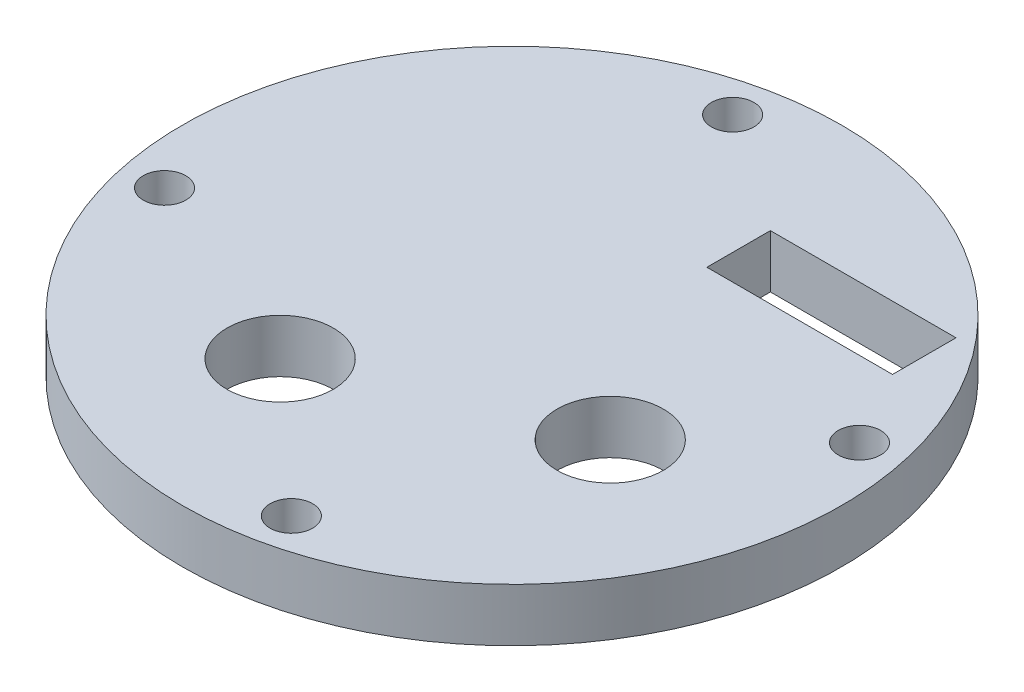
ISO-10303-21;
HEADER;
FILE_DESCRIPTION(('STEP AP214'),'2;1');
FILE_NAME('part.step','',(''),(''),'','','');
FILE_SCHEMA(('AUTOMOTIVE_DESIGN { 1 0 10303 214 1 1 1 1 }'));
ENDSEC;
DATA;
#1=APPLICATION_CONTEXT('core data for automotive mechanical design processes');
#2=APPLICATION_PROTOCOL_DEFINITION('international standard','automotive_design',2000,#1);
#3=PRODUCT_CONTEXT('',#1,'mechanical');
#4=PRODUCT('Part','Part','',(#3));
#5=PRODUCT_RELATED_PRODUCT_CATEGORY('part','',(#4));
#6=PRODUCT_DEFINITION_FORMATION('','',#4);
#7=PRODUCT_DEFINITION_CONTEXT('part definition',#1,'design');
#8=PRODUCT_DEFINITION('design','',#6,#7);
#9=PRODUCT_DEFINITION_SHAPE('','',#8);
#10=(LENGTH_UNIT() NAMED_UNIT(*) SI_UNIT(.MILLI.,.METRE.));
#11=(NAMED_UNIT(*) PLANE_ANGLE_UNIT() SI_UNIT($,.RADIAN.));
#12=(NAMED_UNIT(*) SI_UNIT($,.STERADIAN.) SOLID_ANGLE_UNIT());
#13=UNCERTAINTY_MEASURE_WITH_UNIT(LENGTH_MEASURE(1.E-05),#10,'distance_accuracy_value','');
#14=(GEOMETRIC_REPRESENTATION_CONTEXT(3) GLOBAL_UNCERTAINTY_ASSIGNED_CONTEXT((#13)) GLOBAL_UNIT_ASSIGNED_CONTEXT((#10,
#11,#12)) REPRESENTATION_CONTEXT('',''));
#15=CARTESIAN_POINT('',(0.,0.,0.));
#16=DIRECTION('',(0.,0.,1.));
#17=DIRECTION('',(1.,0.,0.));
#18=AXIS2_PLACEMENT_3D('',#15,#16,#17);
#19=CARTESIAN_POINT('',(0.,5.,0.));
#20=DIRECTION('',(0.,-1.,0.));
#21=DIRECTION('',(0.,0.,-1.));
#22=AXIS2_PLACEMENT_3D('',#19,#20,#21);
#23=CYLINDRICAL_SURFACE('',#22,31.);
#24=CARTESIAN_POINT('',(0.,5.,0.));
#25=DIRECTION('',(0.,1.,0.));
#26=DIRECTION('',(0.,0.,1.));
#27=AXIS2_PLACEMENT_3D('',#24,#25,#26);
#28=CIRCLE('',#27,31.);
#29=CARTESIAN_POINT('',(0.,5.,31.));
#30=VERTEX_POINT('',#29);
#31=EDGE_CURVE('E11',#30,#30,#28,.T.);
#32=ORIENTED_EDGE('',*,*,#31,.F.);
#33=EDGE_LOOP('',(#32));
#34=FACE_BOUND('',#33,.T.);
#35=CARTESIAN_POINT('',(0.,0.,0.));
#36=DIRECTION('',(0.,1.,0.));
#37=DIRECTION('',(0.,0.,1.));
#38=AXIS2_PLACEMENT_3D('',#35,#36,#37);
#39=CIRCLE('',#38,31.);
#40=CARTESIAN_POINT('',(0.,0.,31.));
#41=VERTEX_POINT('',#40);
#42=EDGE_CURVE('E43',#41,#41,#39,.T.);
#43=ORIENTED_EDGE('',*,*,#42,.T.);
#44=EDGE_LOOP('',(#43));
#45=FACE_BOUND('',#44,.T.);
#46=ADVANCED_FACE('F35',(#34,#45),#23,.T.);
#47=CARTESIAN_POINT('',(0.,5.,0.));
#48=DIRECTION('',(0.,1.,0.));
#49=DIRECTION('',(0.,0.,1.));
#50=AXIS2_PLACEMENT_3D('',#47,#48,#49);
#51=PLANE('',#50);
#52=CARTESIAN_POINT('',(14.753523973809,5.,5.51293547961507));
#53=DIRECTION('',(0.,1.,0.));
#54=DIRECTION('',(0.,0.,1.));
#55=AXIS2_PLACEMENT_3D('',#52,#53,#54);
#56=CIRCLE('',#55,5.);
#57=CARTESIAN_POINT('',(14.753523973809,5.,10.5129354796151));
#58=VERTEX_POINT('',#57);
#59=EDGE_CURVE('E278',#58,#58,#56,.T.);
#60=ORIENTED_EDGE('',*,*,#59,.F.);
#61=EDGE_LOOP('',(#60));
#62=FACE_BOUND('',#61,.T.);
#63=CARTESIAN_POINT('',(-7.37244944087934,5.,14.4384035455403));
#64=DIRECTION('',(0.,1.,0.));
#65=DIRECTION('',(0.,0.,1.));
#66=AXIS2_PLACEMENT_3D('',#63,#64,#65);
#67=CIRCLE('',#66,5.);
#68=CARTESIAN_POINT('',(-7.37244944087934,5.,19.4384035455403));
#69=VERTEX_POINT('',#68);
#70=EDGE_CURVE('E101',#69,#69,#67,.T.);
#71=ORIENTED_EDGE('',*,*,#70,.F.);
#72=EDGE_LOOP('',(#71));
#73=FACE_BOUND('',#72,.T.);
#74=DIRECTION('',(0.,0.,-1.));
#75=VECTOR('',#74,1.);
#76=CARTESIAN_POINT('',(22.7143225936288,5.,-19.0522485792144));
#77=LINE('',#76,#75);
#78=CARTESIAN_POINT('',(22.7143225936288,5.,-13.0808841963415));
#79=VERTEX_POINT('',#78);
#80=CARTESIAN_POINT('',(22.7143225936288,5.,-19.0522485792144));
#81=VERTEX_POINT('',#80);
#82=EDGE_CURVE('E51',#79,#81,#77,.T.);
#83=ORIENTED_EDGE('',*,*,#82,.F.);
#84=DIRECTION('',(1.,0.,0.));
#85=VECTOR('',#84,1.);
#86=CARTESIAN_POINT('',(22.7143225936288,5.,-13.0808841963415));
#87=LINE('',#86,#85);
#88=CARTESIAN_POINT('',(5.25229986675413,5.,-13.0808841963415));
#89=VERTEX_POINT('',#88);
#90=EDGE_CURVE('E95',#89,#79,#87,.T.);
#91=ORIENTED_EDGE('',*,*,#90,.F.);
#92=DIRECTION('',(0.,0.,1.));
#93=VECTOR('',#92,1.);
#94=CARTESIAN_POINT('',(5.25229986675413,5.,-19.0522485792144));
#95=LINE('',#94,#93);
#96=CARTESIAN_POINT('',(5.25229986675413,5.,-19.0522485792144));
#97=VERTEX_POINT('',#96);
#98=EDGE_CURVE('E98',#97,#89,#95,.T.);
#99=ORIENTED_EDGE('',*,*,#98,.F.);
#100=DIRECTION('',(-1.,0.,0.));
#101=VECTOR('',#100,1.);
#102=CARTESIAN_POINT('',(22.7143225936288,5.,-19.0522485792144));
#103=LINE('',#102,#101);
#104=EDGE_CURVE('E107',#81,#97,#103,.T.);
#105=ORIENTED_EDGE('',*,*,#104,.F.);
#106=EDGE_LOOP('',(#83,#91,#99,#105));
#107=FACE_BOUND('',#106,.T.);
#108=CARTESIAN_POINT('',(-5.96537627086481,5.,-26.7199553279625));
#109=DIRECTION('',(0.,1.,0.));
#110=DIRECTION('',(0.,0.,1.));
#111=AXIS2_PLACEMENT_3D('',#108,#109,#110);
#112=CIRCLE('',#111,2.);
#113=CARTESIAN_POINT('',(-5.96537627086481,5.,-24.7199553279625));
#114=VERTEX_POINT('',#113);
#115=EDGE_CURVE('E118',#114,#114,#112,.T.);
#116=ORIENTED_EDGE('',*,*,#115,.F.);
#117=EDGE_LOOP('',(#116));
#118=FACE_BOUND('',#117,.T.);
#119=CARTESIAN_POINT('',(26.7199553279625,5.,-5.96537627086472));
#120=DIRECTION('',(0.,1.,0.));
#121=DIRECTION('',(0.,0.,1.));
#122=AXIS2_PLACEMENT_3D('',#119,#120,#121);
#123=CIRCLE('',#122,2.);
#124=CARTESIAN_POINT('',(26.7199553279625,5.,-3.96537627086472));
#125=VERTEX_POINT('',#124);
#126=EDGE_CURVE('E122',#125,#125,#123,.T.);
#127=ORIENTED_EDGE('',*,*,#126,.F.);
#128=EDGE_LOOP('',(#127));
#129=FACE_BOUND('',#128,.T.);
#130=CARTESIAN_POINT('',(5.96537627086463,5.,26.7199553279625));
#131=DIRECTION('',(0.,1.,0.));
#132=DIRECTION('',(0.,0.,1.));
#133=AXIS2_PLACEMENT_3D('',#130,#131,#132);
#134=CIRCLE('',#133,2.);
#135=CARTESIAN_POINT('',(5.96537627086463,5.,28.7199553279625));
#136=VERTEX_POINT('',#135);
#137=EDGE_CURVE('E114',#136,#136,#134,.T.);
#138=ORIENTED_EDGE('',*,*,#137,.F.);
#139=EDGE_LOOP('',(#138));
#140=FACE_BOUND('',#139,.T.);
#141=CARTESIAN_POINT('',(-26.7199553279625,5.,5.96537627086491));
#142=DIRECTION('',(0.,1.,0.));
#143=DIRECTION('',(0.,0.,1.));
#144=AXIS2_PLACEMENT_3D('',#141,#142,#143);
#145=CIRCLE('',#144,2.);
#146=CARTESIAN_POINT('',(-26.7199553279625,5.,7.96537627086491));
#147=VERTEX_POINT('',#146);
#148=EDGE_CURVE('E127',#147,#147,#145,.T.);
#149=ORIENTED_EDGE('',*,*,#148,.F.);
#150=EDGE_LOOP('',(#149));
#151=FACE_BOUND('',#150,.T.);
#152=ORIENTED_EDGE('',*,*,#31,.T.);
#153=EDGE_LOOP('',(#152));
#154=FACE_BOUND('',#153,.T.);
#155=ADVANCED_FACE('F158',(#62,#73,#107,#118,#129,#140,#151,#154),#51,.T.);
#156=CARTESIAN_POINT('',(0.,0.,0.));
#157=DIRECTION('',(0.,1.,0.));
#158=DIRECTION('',(0.,0.,1.));
#159=AXIS2_PLACEMENT_3D('',#156,#157,#158);
#160=PLANE('',#159);
#161=CARTESIAN_POINT('',(14.753523973809,0.,5.51293547961507));
#162=DIRECTION('',(0.,1.,0.));
#163=DIRECTION('',(0.,0.,1.));
#164=AXIS2_PLACEMENT_3D('',#161,#162,#163);
#165=CIRCLE('',#164,5.);
#166=CARTESIAN_POINT('',(14.753523973809,0.,10.5129354796151));
#167=VERTEX_POINT('',#166);
#168=EDGE_CURVE('E275',#167,#167,#165,.T.);
#169=ORIENTED_EDGE('',*,*,#168,.T.);
#170=EDGE_LOOP('',(#169));
#171=FACE_BOUND('',#170,.T.);
#172=CARTESIAN_POINT('',(-7.37244944087934,0.,14.4384035455403));
#173=DIRECTION('',(0.,1.,0.));
#174=DIRECTION('',(0.,0.,1.));
#175=AXIS2_PLACEMENT_3D('',#172,#173,#174);
#176=CIRCLE('',#175,5.);
#177=CARTESIAN_POINT('',(-7.37244944087934,0.,19.4384035455403));
#178=VERTEX_POINT('',#177);
#179=EDGE_CURVE('E108',#178,#178,#176,.T.);
#180=ORIENTED_EDGE('',*,*,#179,.T.);
#181=EDGE_LOOP('',(#180));
#182=FACE_BOUND('',#181,.T.);
#183=DIRECTION('',(1.,0.,0.));
#184=VECTOR('',#183,1.);
#185=CARTESIAN_POINT('',(22.7143225936288,0.,-13.0808841963415));
#186=LINE('',#185,#184);
#187=CARTESIAN_POINT('',(5.25229986675413,0.,-13.0808841963415));
#188=VERTEX_POINT('',#187);
#189=CARTESIAN_POINT('',(22.7143225936288,0.,-13.0808841963415));
#190=VERTEX_POINT('',#189);
#191=EDGE_CURVE('E85',#188,#190,#186,.T.);
#192=ORIENTED_EDGE('',*,*,#191,.T.);
#193=DIRECTION('',(0.,0.,-1.));
#194=VECTOR('',#193,1.);
#195=CARTESIAN_POINT('',(22.7143225936288,0.,-19.0522485792144));
#196=LINE('',#195,#194);
#197=CARTESIAN_POINT('',(22.7143225936288,0.,-19.0522485792144));
#198=VERTEX_POINT('',#197);
#199=EDGE_CURVE('E79',#190,#198,#196,.T.);
#200=ORIENTED_EDGE('',*,*,#199,.T.);
#201=DIRECTION('',(-1.,0.,0.));
#202=VECTOR('',#201,1.);
#203=CARTESIAN_POINT('',(22.7143225936288,0.,-19.0522485792144));
#204=LINE('',#203,#202);
#205=CARTESIAN_POINT('',(5.25229986675413,0.,-19.0522485792144));
#206=VERTEX_POINT('',#205);
#207=EDGE_CURVE('E88',#198,#206,#204,.T.);
#208=ORIENTED_EDGE('',*,*,#207,.T.);
#209=DIRECTION('',(0.,0.,1.));
#210=VECTOR('',#209,1.);
#211=CARTESIAN_POINT('',(5.25229986675413,0.,-19.0522485792144));
#212=LINE('',#211,#210);
#213=EDGE_CURVE('E59',#206,#188,#212,.T.);
#214=ORIENTED_EDGE('',*,*,#213,.T.);
#215=EDGE_LOOP('',(#192,#200,#208,#214));
#216=FACE_BOUND('',#215,.T.);
#217=CARTESIAN_POINT('',(-5.96537627086481,0.,-26.7199553279625));
#218=DIRECTION('',(0.,1.,0.));
#219=DIRECTION('',(0.,0.,1.));
#220=AXIS2_PLACEMENT_3D('',#217,#218,#219);
#221=CIRCLE('',#220,2.);
#222=CARTESIAN_POINT('',(-5.96537627086481,0.,-24.7199553279625));
#223=VERTEX_POINT('',#222);
#224=EDGE_CURVE('E38',#223,#223,#221,.T.);
#225=ORIENTED_EDGE('',*,*,#224,.T.);
#226=EDGE_LOOP('',(#225));
#227=FACE_BOUND('',#226,.T.);
#228=CARTESIAN_POINT('',(26.7199553279625,0.,-5.96537627086472));
#229=DIRECTION('',(0.,1.,0.));
#230=DIRECTION('',(0.,0.,1.));
#231=AXIS2_PLACEMENT_3D('',#228,#229,#230);
#232=CIRCLE('',#231,2.);
#233=CARTESIAN_POINT('',(26.7199553279625,0.,-3.96537627086472));
#234=VERTEX_POINT('',#233);
#235=EDGE_CURVE('E136',#234,#234,#232,.T.);
#236=ORIENTED_EDGE('',*,*,#235,.T.);
#237=EDGE_LOOP('',(#236));
#238=FACE_BOUND('',#237,.T.);
#239=CARTESIAN_POINT('',(5.96537627086463,0.,26.7199553279625));
#240=DIRECTION('',(0.,1.,0.));
#241=DIRECTION('',(0.,0.,1.));
#242=AXIS2_PLACEMENT_3D('',#239,#240,#241);
#243=CIRCLE('',#242,2.);
#244=CARTESIAN_POINT('',(5.96537627086463,0.,28.7199553279625));
#245=VERTEX_POINT('',#244);
#246=EDGE_CURVE('E121',#245,#245,#243,.T.);
#247=ORIENTED_EDGE('',*,*,#246,.T.);
#248=EDGE_LOOP('',(#247));
#249=FACE_BOUND('',#248,.T.);
#250=CARTESIAN_POINT('',(-26.7199553279625,0.,5.96537627086491));
#251=DIRECTION('',(0.,1.,0.));
#252=DIRECTION('',(0.,0.,1.));
#253=AXIS2_PLACEMENT_3D('',#250,#251,#252);
#254=CIRCLE('',#253,2.);
#255=CARTESIAN_POINT('',(-26.7199553279625,0.,7.96537627086491));
#256=VERTEX_POINT('',#255);
#257=EDGE_CURVE('E129',#256,#256,#254,.T.);
#258=ORIENTED_EDGE('',*,*,#257,.T.);
#259=EDGE_LOOP('',(#258));
#260=FACE_BOUND('',#259,.T.);
#261=ORIENTED_EDGE('',*,*,#42,.F.);
#262=EDGE_LOOP('',(#261));
#263=FACE_BOUND('',#262,.T.);
#264=ADVANCED_FACE('F92',(#171,#182,#216,#227,#238,#249,#260,#263),#160,.F.);
#265=CARTESIAN_POINT('',(-26.7199553279625,-7.5,5.96537627086491));
#266=DIRECTION('',(0.,1.,0.));
#267=DIRECTION('',(0.,0.,1.));
#268=AXIS2_PLACEMENT_3D('',#265,#266,#267);
#269=CYLINDRICAL_SURFACE('',#268,2.);
#270=ORIENTED_EDGE('',*,*,#148,.T.);
#271=EDGE_LOOP('',(#270));
#272=FACE_BOUND('',#271,.T.);
#273=ORIENTED_EDGE('',*,*,#257,.F.);
#274=EDGE_LOOP('',(#273));
#275=FACE_BOUND('',#274,.T.);
#276=ADVANCED_FACE('F170',(#272,#275),#269,.F.);
#277=CARTESIAN_POINT('',(5.96537627086463,-7.5,26.7199553279625));
#278=DIRECTION('',(0.,1.,0.));
#279=DIRECTION('',(0.,0.,1.));
#280=AXIS2_PLACEMENT_3D('',#277,#278,#279);
#281=CYLINDRICAL_SURFACE('',#280,2.);
#282=ORIENTED_EDGE('',*,*,#137,.T.);
#283=EDGE_LOOP('',(#282));
#284=FACE_BOUND('',#283,.T.);
#285=ORIENTED_EDGE('',*,*,#246,.F.);
#286=EDGE_LOOP('',(#285));
#287=FACE_BOUND('',#286,.T.);
#288=ADVANCED_FACE('F154',(#284,#287),#281,.F.);
#289=CARTESIAN_POINT('',(26.7199553279625,-7.5,-5.96537627086472));
#290=DIRECTION('',(0.,1.,0.));
#291=DIRECTION('',(0.,0.,1.));
#292=AXIS2_PLACEMENT_3D('',#289,#290,#291);
#293=CYLINDRICAL_SURFACE('',#292,2.);
#294=ORIENTED_EDGE('',*,*,#126,.T.);
#295=EDGE_LOOP('',(#294));
#296=FACE_BOUND('',#295,.T.);
#297=ORIENTED_EDGE('',*,*,#235,.F.);
#298=EDGE_LOOP('',(#297));
#299=FACE_BOUND('',#298,.T.);
#300=ADVANCED_FACE('F145',(#296,#299),#293,.F.);
#301=CARTESIAN_POINT('',(-5.96537627086481,-7.5,-26.7199553279625));
#302=DIRECTION('',(0.,1.,0.));
#303=DIRECTION('',(0.,0.,1.));
#304=AXIS2_PLACEMENT_3D('',#301,#302,#303);
#305=CYLINDRICAL_SURFACE('',#304,2.);
#306=ORIENTED_EDGE('',*,*,#115,.T.);
#307=EDGE_LOOP('',(#306));
#308=FACE_BOUND('',#307,.T.);
#309=ORIENTED_EDGE('',*,*,#224,.F.);
#310=EDGE_LOOP('',(#309));
#311=FACE_BOUND('',#310,.T.);
#312=ADVANCED_FACE('F143',(#308,#311),#305,.F.);
#313=CARTESIAN_POINT('',(22.7143225936288,0.,-19.0522485792144));
#314=DIRECTION('',(1.,0.,0.));
#315=DIRECTION('',(0.,0.,-1.));
#316=AXIS2_PLACEMENT_3D('',#313,#314,#315);
#317=PLANE('',#316);
#318=ORIENTED_EDGE('',*,*,#82,.T.);
#319=DIRECTION('',(0.,1.,0.));
#320=VECTOR('',#319,1.);
#321=CARTESIAN_POINT('',(22.7143225936288,0.,-19.0522485792144));
#322=LINE('',#321,#320);
#323=EDGE_CURVE('E75',#198,#81,#322,.T.);
#324=ORIENTED_EDGE('',*,*,#323,.F.);
#325=ORIENTED_EDGE('',*,*,#199,.F.);
#326=DIRECTION('',(0.,1.,0.));
#327=VECTOR('',#326,1.);
#328=CARTESIAN_POINT('',(22.7143225936288,0.,-13.0808841963415));
#329=LINE('',#328,#327);
#330=EDGE_CURVE('E112',#190,#79,#329,.T.);
#331=ORIENTED_EDGE('',*,*,#330,.T.);
#332=EDGE_LOOP('',(#318,#324,#325,#331));
#333=FACE_BOUND('',#332,.T.);
#334=ADVANCED_FACE('F77',(#333),#317,.F.);
#335=CARTESIAN_POINT('',(22.7143225936288,0.,-13.0808841963415));
#336=DIRECTION('',(0.,0.,1.));
#337=DIRECTION('',(1.,0.,0.));
#338=AXIS2_PLACEMENT_3D('',#335,#336,#337);
#339=PLANE('',#338);
#340=ORIENTED_EDGE('',*,*,#90,.T.);
#341=ORIENTED_EDGE('',*,*,#330,.F.);
#342=ORIENTED_EDGE('',*,*,#191,.F.);
#343=DIRECTION('',(0.,1.,0.));
#344=VECTOR('',#343,1.);
#345=CARTESIAN_POINT('',(5.25229986675413,0.,-13.0808841963415));
#346=LINE('',#345,#344);
#347=EDGE_CURVE('E115',#188,#89,#346,.T.);
#348=ORIENTED_EDGE('',*,*,#347,.T.);
#349=EDGE_LOOP('',(#340,#341,#342,#348));
#350=FACE_BOUND('',#349,.T.);
#351=ADVANCED_FACE('F152',(#350),#339,.F.);
#352=CARTESIAN_POINT('',(5.25229986675413,0.,-19.0522485792144));
#353=DIRECTION('',(-1.,0.,0.));
#354=DIRECTION('',(0.,0.,1.));
#355=AXIS2_PLACEMENT_3D('',#352,#353,#354);
#356=PLANE('',#355);
#357=ORIENTED_EDGE('',*,*,#98,.T.);
#358=ORIENTED_EDGE('',*,*,#347,.F.);
#359=ORIENTED_EDGE('',*,*,#213,.F.);
#360=DIRECTION('',(0.,1.,0.));
#361=VECTOR('',#360,1.);
#362=CARTESIAN_POINT('',(5.25229986675413,0.,-19.0522485792144));
#363=LINE('',#362,#361);
#364=EDGE_CURVE('E84',#206,#97,#363,.T.);
#365=ORIENTED_EDGE('',*,*,#364,.T.);
#366=EDGE_LOOP('',(#357,#358,#359,#365));
#367=FACE_BOUND('',#366,.T.);
#368=ADVANCED_FACE('F220',(#367),#356,.F.);
#369=CARTESIAN_POINT('',(22.7143225936288,0.,-19.0522485792144));
#370=DIRECTION('',(0.,0.,-1.));
#371=DIRECTION('',(-1.,0.,0.));
#372=AXIS2_PLACEMENT_3D('',#369,#370,#371);
#373=PLANE('',#372);
#374=ORIENTED_EDGE('',*,*,#104,.T.);
#375=ORIENTED_EDGE('',*,*,#364,.F.);
#376=ORIENTED_EDGE('',*,*,#207,.F.);
#377=ORIENTED_EDGE('',*,*,#323,.T.);
#378=EDGE_LOOP('',(#374,#375,#376,#377));
#379=FACE_BOUND('',#378,.T.);
#380=ADVANCED_FACE('F89',(#379),#373,.F.);
#381=CARTESIAN_POINT('',(-7.37244944087934,0.,14.4384035455403));
#382=DIRECTION('',(0.,1.,0.));
#383=DIRECTION('',(0.,0.,1.));
#384=AXIS2_PLACEMENT_3D('',#381,#382,#383);
#385=CYLINDRICAL_SURFACE('',#384,5.);
#386=ORIENTED_EDGE('',*,*,#179,.F.);
#387=EDGE_LOOP('',(#386));
#388=FACE_BOUND('',#387,.T.);
#389=ORIENTED_EDGE('',*,*,#70,.T.);
#390=EDGE_LOOP('',(#389));
#391=FACE_BOUND('',#390,.T.);
#392=ADVANCED_FACE('F238',(#388,#391),#385,.F.);
#393=CARTESIAN_POINT('',(14.753523973809,0.,5.51293547961507));
#394=DIRECTION('',(0.,1.,0.));
#395=DIRECTION('',(0.,0.,1.));
#396=AXIS2_PLACEMENT_3D('',#393,#394,#395);
#397=CYLINDRICAL_SURFACE('',#396,5.);
#398=ORIENTED_EDGE('',*,*,#168,.F.);
#399=EDGE_LOOP('',(#398));
#400=FACE_BOUND('',#399,.T.);
#401=ORIENTED_EDGE('',*,*,#59,.T.);
#402=EDGE_LOOP('',(#401));
#403=FACE_BOUND('',#402,.T.);
#404=ADVANCED_FACE('F259',(#400,#403),#397,.F.);
#405=CLOSED_SHELL('',(#46,#155,#264,#276,#288,#300,#312,#334,#351,#368,#380,#392,#404));
#406=MANIFOLD_SOLID_BREP('B2',#405);
#407=ADVANCED_BREP_SHAPE_REPRESENTATION('',(#18,#406),#14);
#408=SHAPE_DEFINITION_REPRESENTATION(#9,#407);
ENDSEC;
END-ISO-10303-21;
